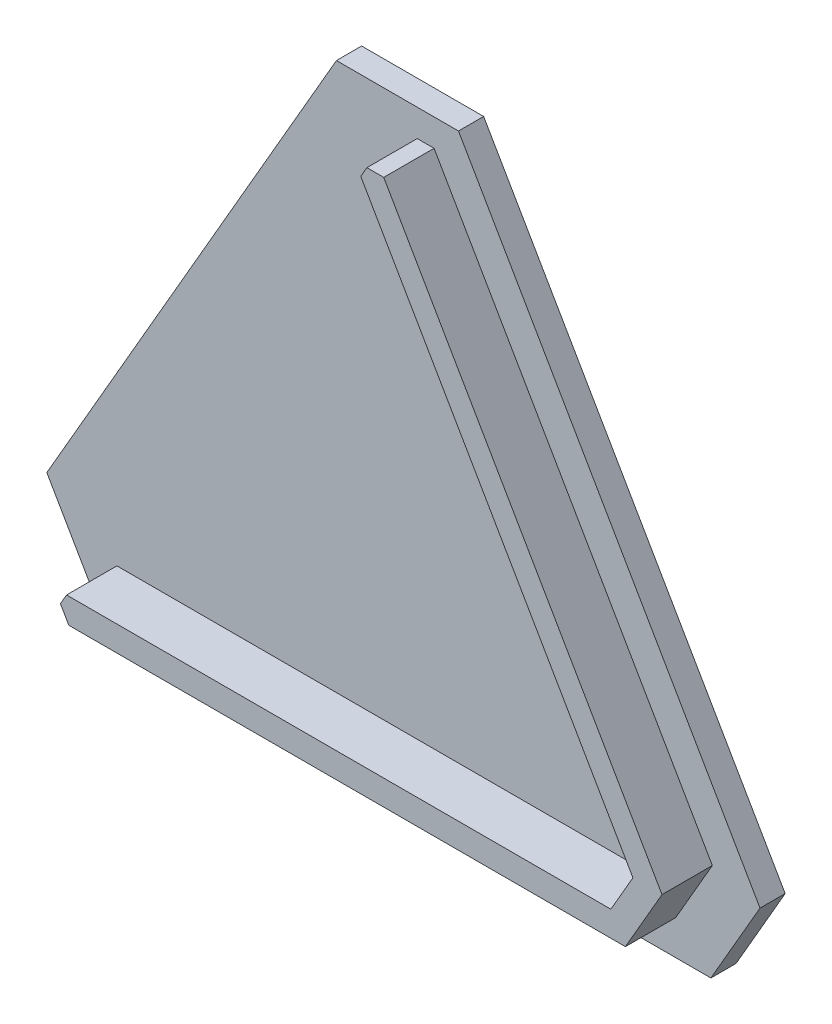
ISO-10303-21;
HEADER;
FILE_DESCRIPTION(('STEP AP214'),'2;1');
FILE_NAME('part.step','',(''),(''),'','','');
FILE_SCHEMA(('AUTOMOTIVE_DESIGN { 1 0 10303 214 1 1 1 1 }'));
ENDSEC;
DATA;
#1=APPLICATION_CONTEXT('core data for automotive mechanical design processes');
#2=APPLICATION_PROTOCOL_DEFINITION('international standard','automotive_design',2000,#1);
#3=PRODUCT_CONTEXT('',#1,'mechanical');
#4=PRODUCT('Part','Part','',(#3));
#5=PRODUCT_RELATED_PRODUCT_CATEGORY('part','',(#4));
#6=PRODUCT_DEFINITION_FORMATION('','',#4);
#7=PRODUCT_DEFINITION_CONTEXT('part definition',#1,'design');
#8=PRODUCT_DEFINITION('design','',#6,#7);
#9=PRODUCT_DEFINITION_SHAPE('','',#8);
#10=(LENGTH_UNIT() NAMED_UNIT(*) SI_UNIT(.MILLI.,.METRE.));
#11=(NAMED_UNIT(*) PLANE_ANGLE_UNIT() SI_UNIT($,.RADIAN.));
#12=(NAMED_UNIT(*) SI_UNIT($,.STERADIAN.) SOLID_ANGLE_UNIT());
#13=UNCERTAINTY_MEASURE_WITH_UNIT(LENGTH_MEASURE(1.E-05),#10,'distance_accuracy_value','');
#14=(GEOMETRIC_REPRESENTATION_CONTEXT(3) GLOBAL_UNCERTAINTY_ASSIGNED_CONTEXT((#13)) GLOBAL_UNIT_ASSIGNED_CONTEXT((#10,
#11,#12)) REPRESENTATION_CONTEXT('',''));
#15=CARTESIAN_POINT('',(0.,0.,0.));
#16=DIRECTION('',(0.,0.,1.));
#17=DIRECTION('',(1.,0.,0.));
#18=AXIS2_PLACEMENT_3D('',#15,#16,#17);
#19=CARTESIAN_POINT('',(222.11595741586,-44.1065145182755,287.147776460053));
#20=DIRECTION('',(0.,1.,0.));
#21=DIRECTION('',(0.,0.,-1.));
#22=AXIS2_PLACEMENT_3D('',#19,#20,#21);
#23=PLANE('',#22);
#24=DIRECTION('',(-1.,0.,0.));
#25=VECTOR('',#24,1.);
#26=CARTESIAN_POINT('',(222.11595741586,-44.1065145182755,277.147776460053));
#27=LINE('',#26,#25);
#28=CARTESIAN_POINT('',(222.11595741586,-44.1065145182755,277.147776460053));
#29=VERTEX_POINT('',#28);
#30=CARTESIAN_POINT('',(218.778432853491,-44.1065145182755,277.147776460053));
#31=VERTEX_POINT('',#30);
#32=EDGE_CURVE('E143',#29,#31,#27,.T.);
#33=ORIENTED_EDGE('',*,*,#32,.T.);
#34=DIRECTION('',(0.,0.,-1.));
#35=VECTOR('',#34,1.);
#36=CARTESIAN_POINT('',(218.778432853491,-44.1065145182755,287.147776460053));
#37=LINE('',#36,#35);
#38=CARTESIAN_POINT('',(218.778432853491,-44.1065145182755,287.147776460053));
#39=VERTEX_POINT('',#38);
#40=EDGE_CURVE('E38',#39,#31,#37,.T.);
#41=ORIENTED_EDGE('',*,*,#40,.F.);
#42=DIRECTION('',(-1.,0.,0.));
#43=VECTOR('',#42,1.);
#44=CARTESIAN_POINT('',(222.11595741586,-44.1065145182755,287.147776460053));
#45=LINE('',#44,#43);
#46=CARTESIAN_POINT('',(222.11595741586,-44.1065145182755,287.147776460053));
#47=VERTEX_POINT('',#46);
#48=EDGE_CURVE('E162',#47,#39,#45,.T.);
#49=ORIENTED_EDGE('',*,*,#48,.F.);
#50=DIRECTION('',(0.,0.,-1.));
#51=VECTOR('',#50,1.);
#52=CARTESIAN_POINT('',(222.11595741586,-44.1065145182755,287.147776460053));
#53=LINE('',#52,#51);
#54=EDGE_CURVE('E11',#47,#29,#53,.T.);
#55=ORIENTED_EDGE('',*,*,#54,.T.);
#56=EDGE_LOOP('',(#33,#41,#49,#55));
#57=FACE_BOUND('',#56,.T.);
#58=ADVANCED_FACE('F35',(#57),#23,.T.);
#59=CARTESIAN_POINT('',(222.11595741586,-44.1065145182755,287.147776460053));
#60=DIRECTION('',(0.866025403784439,0.5,0.));
#61=DIRECTION('',(-0.5,0.866025403784439,0.));
#62=AXIS2_PLACEMENT_3D('',#59,#60,#61);
#63=PLANE('',#62);
#64=DIRECTION('',(-0.5,0.866025403784439,0.));
#65=VECTOR('',#64,1.);
#66=CARTESIAN_POINT('',(222.11595741586,-44.1065145182755,277.147776460053));
#67=LINE('',#66,#65);
#68=CARTESIAN_POINT('',(277.385017308185,-139.835334338348,277.147776460053));
#69=VERTEX_POINT('',#68);
#70=EDGE_CURVE('E92',#69,#29,#67,.T.);
#71=ORIENTED_EDGE('',*,*,#70,.T.);
#72=ORIENTED_EDGE('',*,*,#54,.F.);
#73=DIRECTION('',(-0.5,0.866025403784439,0.));
#74=VECTOR('',#73,1.);
#75=CARTESIAN_POINT('',(222.11595741586,-44.1065145182755,287.147776460053));
#76=LINE('',#75,#74);
#77=CARTESIAN_POINT('',(277.385017308185,-139.835334338348,287.147776460053));
#78=VERTEX_POINT('',#77);
#79=EDGE_CURVE('E53',#78,#47,#76,.T.);
#80=ORIENTED_EDGE('',*,*,#79,.F.);
#81=DIRECTION('',(0.,0.,-1.));
#82=VECTOR('',#81,1.);
#83=CARTESIAN_POINT('',(277.385017308185,-139.835334338348,287.147776460053));
#84=LINE('',#83,#82);
#85=EDGE_CURVE('E44',#78,#69,#84,.T.);
#86=ORIENTED_EDGE('',*,*,#85,.T.);
#87=EDGE_LOOP('',(#71,#72,#80,#86));
#88=FACE_BOUND('',#87,.T.);
#89=ADVANCED_FACE('F229',(#88),#63,.T.);
#90=CARTESIAN_POINT('',(277.385017308185,-139.835334338348,287.147776460053));
#91=DIRECTION('',(0.866025403784438,-0.500000000000001,0.));
#92=DIRECTION('',(0.500000000000001,0.866025403784438,0.));
#93=AXIS2_PLACEMENT_3D('',#90,#91,#92);
#94=PLANE('',#93);
#95=DIRECTION('',(0.500000000000001,0.866025403784438,0.));
#96=VECTOR('',#95,1.);
#97=CARTESIAN_POINT('',(277.385017308185,-139.835334338348,277.147776460053));
#98=LINE('',#97,#96);
#99=CARTESIAN_POINT('',(270.11595741586,-152.425715395115,277.147776460053));
#100=VERTEX_POINT('',#99);
#101=EDGE_CURVE('E86',#100,#69,#98,.T.);
#102=ORIENTED_EDGE('',*,*,#101,.T.);
#103=ORIENTED_EDGE('',*,*,#85,.F.);
#104=DIRECTION('',(0.500000000000001,0.866025403784438,0.));
#105=VECTOR('',#104,1.);
#106=CARTESIAN_POINT('',(277.385017308185,-139.835334338348,287.147776460053));
#107=LINE('',#106,#105);
#108=CARTESIAN_POINT('',(270.11595741586,-152.425715395115,287.147776460053));
#109=VERTEX_POINT('',#108);
#110=EDGE_CURVE('E125',#109,#78,#107,.T.);
#111=ORIENTED_EDGE('',*,*,#110,.F.);
#112=DIRECTION('',(0.,0.,-1.));
#113=VECTOR('',#112,1.);
#114=CARTESIAN_POINT('',(270.11595741586,-152.425715395115,287.147776460053));
#115=LINE('',#114,#113);
#116=EDGE_CURVE('E132',#109,#100,#115,.T.);
#117=ORIENTED_EDGE('',*,*,#116,.T.);
#118=EDGE_LOOP('',(#102,#103,#111,#117));
#119=FACE_BOUND('',#118,.T.);
#120=ADVANCED_FACE('F138',(#119),#94,.T.);
#121=CARTESIAN_POINT('',(270.11595741586,-152.425715395115,287.147776460053));
#122=DIRECTION('',(0.,-1.,0.));
#123=DIRECTION('',(1.,0.,0.));
#124=AXIS2_PLACEMENT_3D('',#121,#122,#123);
#125=PLANE('',#124);
#126=DIRECTION('',(1.,0.,0.));
#127=VECTOR('',#126,1.);
#128=CARTESIAN_POINT('',(270.11595741586,-152.425715395115,277.147776460053));
#129=LINE('',#128,#127);
#130=CARTESIAN_POINT('',(159.577837631212,-152.425715395115,277.147776460053));
#131=VERTEX_POINT('',#130);
#132=EDGE_CURVE('E135',#131,#100,#129,.T.);
#133=ORIENTED_EDGE('',*,*,#132,.T.);
#134=ORIENTED_EDGE('',*,*,#116,.F.);
#135=DIRECTION('',(1.,0.,0.));
#136=VECTOR('',#135,1.);
#137=CARTESIAN_POINT('',(270.11595741586,-152.425715395115,287.147776460053));
#138=LINE('',#137,#136);
#139=CARTESIAN_POINT('',(159.577837631212,-152.425715395115,287.147776460053));
#140=VERTEX_POINT('',#139);
#141=EDGE_CURVE('E121',#140,#109,#138,.T.);
#142=ORIENTED_EDGE('',*,*,#141,.F.);
#143=DIRECTION('',(0.,0.,-1.));
#144=VECTOR('',#143,1.);
#145=CARTESIAN_POINT('',(159.577837631212,-152.425715395115,287.147776460053));
#146=LINE('',#145,#144);
#147=EDGE_CURVE('E136',#140,#131,#146,.T.);
#148=ORIENTED_EDGE('',*,*,#147,.T.);
#149=EDGE_LOOP('',(#133,#134,#142,#148));
#150=FACE_BOUND('',#149,.T.);
#151=ADVANCED_FACE('F133',(#150),#125,.T.);
#152=CARTESIAN_POINT('',(159.577837631212,-152.425715395115,287.147776460053));
#153=DIRECTION('',(-0.866025403784441,-0.499999999999996,0.));
#154=DIRECTION('',(0.499999999999996,-0.866025403784441,0.));
#155=AXIS2_PLACEMENT_3D('',#152,#153,#154);
#156=PLANE('',#155);
#157=DIRECTION('',(0.499999999999996,-0.866025403784441,0.));
#158=VECTOR('',#157,1.);
#159=CARTESIAN_POINT('',(159.577837631212,-152.425715395115,277.147776460053));
#160=LINE('',#159,#158);
#161=CARTESIAN_POINT('',(157.909075350027,-149.535334338348,277.147776460053));
#162=VERTEX_POINT('',#161);
#163=EDGE_CURVE('E158',#162,#131,#160,.T.);
#164=ORIENTED_EDGE('',*,*,#163,.T.);
#165=ORIENTED_EDGE('',*,*,#147,.F.);
#166=DIRECTION('',(0.499999999999996,-0.866025403784441,0.));
#167=VECTOR('',#166,1.);
#168=CARTESIAN_POINT('',(159.577837631212,-152.425715395115,287.147776460053));
#169=LINE('',#168,#167);
#170=CARTESIAN_POINT('',(157.909075350027,-149.535334338348,287.147776460053));
#171=VERTEX_POINT('',#170);
#172=EDGE_CURVE('E127',#171,#140,#169,.T.);
#173=ORIENTED_EDGE('',*,*,#172,.F.);
#174=DIRECTION('',(0.,0.,-1.));
#175=VECTOR('',#174,1.);
#176=CARTESIAN_POINT('',(157.909075350027,-149.535334338348,287.147776460053));
#177=LINE('',#176,#175);
#178=EDGE_CURVE('E166',#171,#162,#177,.T.);
#179=ORIENTED_EDGE('',*,*,#178,.T.);
#180=EDGE_LOOP('',(#164,#165,#173,#179));
#181=FACE_BOUND('',#180,.T.);
#182=ADVANCED_FACE('F217',(#181),#156,.T.);
#183=CARTESIAN_POINT('',(157.909075350027,-149.535334338348,287.147776460053));
#184=DIRECTION('',(-0.866025403784442,0.499999999999994,0.));
#185=DIRECTION('',(-0.499999999999994,-0.866025403784442,0.));
#186=AXIS2_PLACEMENT_3D('',#183,#184,#185);
#187=PLANE('',#186);
#188=DIRECTION('',(-0.499999999999994,-0.866025403784442,0.));
#189=VECTOR('',#188,1.);
#190=CARTESIAN_POINT('',(157.909075350027,-149.535334338348,277.147776460053));
#191=LINE('',#190,#189);
#192=CARTESIAN_POINT('',(159.127064414791,-147.425715395115,277.147776460053));
#193=VERTEX_POINT('',#192);
#194=EDGE_CURVE('E156',#193,#162,#191,.T.);
#195=ORIENTED_EDGE('',*,*,#194,.T.);
#196=ORIENTED_EDGE('',*,*,#178,.F.);
#197=DIRECTION('',(-0.499999999999994,-0.866025403784442,0.));
#198=VECTOR('',#197,1.);
#199=CARTESIAN_POINT('',(157.909075350027,-149.535334338348,287.147776460053));
#200=LINE('',#199,#198);
#201=CARTESIAN_POINT('',(159.127064414791,-147.425715395115,287.147776460053));
#202=VERTEX_POINT('',#201);
#203=EDGE_CURVE('E204',#202,#171,#200,.T.);
#204=ORIENTED_EDGE('',*,*,#203,.F.);
#205=DIRECTION('',(0.,0.,-1.));
#206=VECTOR('',#205,1.);
#207=CARTESIAN_POINT('',(159.127064414791,-147.425715395115,287.147776460053));
#208=LINE('',#207,#206);
#209=EDGE_CURVE('E169',#202,#193,#208,.T.);
#210=ORIENTED_EDGE('',*,*,#209,.T.);
#211=EDGE_LOOP('',(#195,#196,#204,#210));
#212=FACE_BOUND('',#211,.T.);
#213=ADVANCED_FACE('F213',(#212),#187,.T.);
#214=CARTESIAN_POINT('',(159.127064414791,-147.425715395115,287.147776460053));
#215=DIRECTION('',(0.,1.,0.));
#216=DIRECTION('',(0.,0.,-1.));
#217=AXIS2_PLACEMENT_3D('',#214,#215,#216);
#218=PLANE('',#217);
#219=DIRECTION('',(-1.,0.,0.));
#220=VECTOR('',#219,1.);
#221=CARTESIAN_POINT('',(159.127064414791,-147.425715395115,277.147776460053));
#222=LINE('',#221,#220);
#223=CARTESIAN_POINT('',(267.229206069912,-147.425715395115,277.147776460053));
#224=VERTEX_POINT('',#223);
#225=EDGE_CURVE('E154',#224,#193,#222,.T.);
#226=ORIENTED_EDGE('',*,*,#225,.T.);
#227=ORIENTED_EDGE('',*,*,#209,.F.);
#228=DIRECTION('',(-1.,0.,0.));
#229=VECTOR('',#228,1.);
#230=CARTESIAN_POINT('',(159.127064414791,-147.425715395115,287.147776460053));
#231=LINE('',#230,#229);
#232=CARTESIAN_POINT('',(267.229206069912,-147.425715395115,287.147776460053));
#233=VERTEX_POINT('',#232);
#234=EDGE_CURVE('E201',#233,#202,#231,.T.);
#235=ORIENTED_EDGE('',*,*,#234,.F.);
#236=DIRECTION('',(0.,0.,-1.));
#237=VECTOR('',#236,1.);
#238=CARTESIAN_POINT('',(267.229206069912,-147.425715395115,287.147776460053));
#239=LINE('',#238,#237);
#240=EDGE_CURVE('E172',#233,#224,#239,.T.);
#241=ORIENTED_EDGE('',*,*,#240,.T.);
#242=EDGE_LOOP('',(#226,#227,#235,#241));
#243=FACE_BOUND('',#242,.T.);
#244=ADVANCED_FACE('F219',(#243),#218,.T.);
#245=CARTESIAN_POINT('',(267.229206069912,-147.425715395115,287.147776460053));
#246=DIRECTION('',(-0.866025403784438,0.500000000000001,0.));
#247=DIRECTION('',(-0.500000000000001,-0.866025403784438,0.));
#248=AXIS2_PLACEMENT_3D('',#245,#246,#247);
#249=PLANE('',#248);
#250=DIRECTION('',(-0.500000000000001,-0.866025403784438,0.));
#251=VECTOR('',#250,1.);
#252=CARTESIAN_POINT('',(267.229206069912,-147.425715395115,277.147776460053));
#253=LINE('',#252,#251);
#254=CARTESIAN_POINT('',(271.611514616288,-139.835334338348,277.147776460053));
#255=VERTEX_POINT('',#254);
#256=EDGE_CURVE('E152',#255,#224,#253,.T.);
#257=ORIENTED_EDGE('',*,*,#256,.T.);
#258=ORIENTED_EDGE('',*,*,#240,.F.);
#259=DIRECTION('',(-0.500000000000001,-0.866025403784438,0.));
#260=VECTOR('',#259,1.);
#261=CARTESIAN_POINT('',(267.229206069912,-147.425715395115,287.147776460053));
#262=LINE('',#261,#260);
#263=CARTESIAN_POINT('',(271.611514616288,-139.835334338348,287.147776460053));
#264=VERTEX_POINT('',#263);
#265=EDGE_CURVE('E199',#264,#233,#262,.T.);
#266=ORIENTED_EDGE('',*,*,#265,.F.);
#267=DIRECTION('',(0.,0.,-1.));
#268=VECTOR('',#267,1.);
#269=CARTESIAN_POINT('',(271.611514616288,-139.835334338348,287.147776460053));
#270=LINE('',#269,#268);
#271=EDGE_CURVE('E175',#264,#255,#270,.T.);
#272=ORIENTED_EDGE('',*,*,#271,.T.);
#273=EDGE_LOOP('',(#257,#258,#266,#272));
#274=FACE_BOUND('',#273,.T.);
#275=ADVANCED_FACE('F197',(#274),#249,.T.);
#276=CARTESIAN_POINT('',(271.611514616288,-139.835334338348,287.147776460053));
#277=DIRECTION('',(-0.866025403784438,-0.5,0.));
#278=DIRECTION('',(0.5,-0.866025403784439,0.));
#279=AXIS2_PLACEMENT_3D('',#276,#277,#278);
#280=PLANE('',#279);
#281=DIRECTION('',(0.5,-0.866025403784438,0.));
#282=VECTOR('',#281,1.);
#283=CARTESIAN_POINT('',(271.611514616288,-139.835334338348,277.147776460053));
#284=LINE('',#283,#282);
#285=CARTESIAN_POINT('',(217.560443788727,-46.2161334615091,277.147776460053));
#286=VERTEX_POINT('',#285);
#287=EDGE_CURVE('E150',#286,#255,#284,.T.);
#288=ORIENTED_EDGE('',*,*,#287,.T.);
#289=ORIENTED_EDGE('',*,*,#271,.F.);
#290=DIRECTION('',(0.5,-0.866025403784438,0.));
#291=VECTOR('',#290,1.);
#292=CARTESIAN_POINT('',(271.611514616288,-139.835334338348,287.147776460053));
#293=LINE('',#292,#291);
#294=CARTESIAN_POINT('',(217.560443788727,-46.2161334615091,287.147776460053));
#295=VERTEX_POINT('',#294);
#296=EDGE_CURVE('E202',#295,#264,#293,.T.);
#297=ORIENTED_EDGE('',*,*,#296,.F.);
#298=DIRECTION('',(0.,0.,-1.));
#299=VECTOR('',#298,1.);
#300=CARTESIAN_POINT('',(217.560443788727,-46.2161334615091,287.147776460053));
#301=LINE('',#300,#299);
#302=EDGE_CURVE('E177',#295,#286,#301,.T.);
#303=ORIENTED_EDGE('',*,*,#302,.T.);
#304=EDGE_LOOP('',(#288,#289,#297,#303));
#305=FACE_BOUND('',#304,.T.);
#306=ADVANCED_FACE('F194',(#305),#280,.T.);
#307=CARTESIAN_POINT('',(218.778432853491,-44.1065145182755,287.147776460053));
#308=DIRECTION('',(-0.866025403784437,0.500000000000003,0.));
#309=DIRECTION('',(-0.500000000000003,-0.866025403784437,0.));
#310=AXIS2_PLACEMENT_3D('',#307,#308,#309);
#311=PLANE('',#310);
#312=DIRECTION('',(-0.500000000000003,-0.866025403784437,0.));
#313=VECTOR('',#312,1.);
#314=CARTESIAN_POINT('',(218.778432853491,-44.1065145182755,277.147776460053));
#315=LINE('',#314,#313);
#316=EDGE_CURVE('E146',#31,#286,#315,.T.);
#317=ORIENTED_EDGE('',*,*,#316,.T.);
#318=ORIENTED_EDGE('',*,*,#302,.F.);
#319=DIRECTION('',(-0.500000000000003,-0.866025403784437,0.));
#320=VECTOR('',#319,1.);
#321=CARTESIAN_POINT('',(218.778432853491,-44.1065145182755,287.147776460053));
#322=LINE('',#321,#320);
#323=EDGE_CURVE('E100',#39,#295,#322,.T.);
#324=ORIENTED_EDGE('',*,*,#323,.F.);
#325=ORIENTED_EDGE('',*,*,#40,.T.);
#326=EDGE_LOOP('',(#317,#318,#324,#325));
#327=FACE_BOUND('',#326,.T.);
#328=ADVANCED_FACE('F183',(#327),#311,.T.);
#329=CARTESIAN_POINT('',(218.778432853491,-44.1065145182755,287.147776460053));
#330=DIRECTION('',(0.,0.,-1.));
#331=DIRECTION('',(1.,0.,0.));
#332=AXIS2_PLACEMENT_3D('',#329,#330,#331);
#333=PLANE('',#332);
#334=ORIENTED_EDGE('',*,*,#48,.T.);
#335=ORIENTED_EDGE('',*,*,#323,.T.);
#336=ORIENTED_EDGE('',*,*,#296,.T.);
#337=ORIENTED_EDGE('',*,*,#265,.T.);
#338=ORIENTED_EDGE('',*,*,#234,.T.);
#339=ORIENTED_EDGE('',*,*,#203,.T.);
#340=ORIENTED_EDGE('',*,*,#172,.T.);
#341=ORIENTED_EDGE('',*,*,#141,.T.);
#342=ORIENTED_EDGE('',*,*,#110,.T.);
#343=ORIENTED_EDGE('',*,*,#79,.T.);
#344=EDGE_LOOP('',(#334,#335,#336,#337,#338,#339,#340,#341,#342,#343));
#345=FACE_BOUND('',#344,.T.);
#346=ADVANCED_FACE('F123',(#345),#333,.F.);
#347=CARTESIAN_POINT('',(145.207369427855,-138.335334338348,272.147776460053));
#348=DIRECTION('',(0.866025403784439,-0.499999999999999,0.));
#349=DIRECTION('',(0.499999999999999,0.866025403784439,0.));
#350=AXIS2_PLACEMENT_3D('',#347,#348,#349);
#351=PLANE('',#350);
#352=DIRECTION('',(-0.499999999999999,-0.866025403784439,0.));
#353=VECTOR('',#352,1.);
#354=CARTESIAN_POINT('',(145.207369427855,-138.335334338348,277.147776460053));
#355=LINE('',#354,#353);
#356=CARTESIAN_POINT('',(202.728095370019,-38.7065145182755,277.147776460053));
#357=VERTEX_POINT('',#356);
#358=CARTESIAN_POINT('',(145.207369427855,-138.335334338348,277.147776460053));
#359=VERTEX_POINT('',#358);
#360=EDGE_CURVE('E448',#357,#359,#355,.T.);
#361=ORIENTED_EDGE('',*,*,#360,.F.);
#362=DIRECTION('',(0.,0.,1.));
#363=VECTOR('',#362,1.);
#364=CARTESIAN_POINT('',(202.728095370019,-38.7065145182755,272.147776460053));
#365=LINE('',#364,#363);
#366=CARTESIAN_POINT('',(202.728095370019,-38.7065145182755,272.147776460053));
#367=VERTEX_POINT('',#366);
#368=EDGE_CURVE('E445',#367,#357,#365,.T.);
#369=ORIENTED_EDGE('',*,*,#368,.F.);
#370=DIRECTION('',(-0.499999999999999,-0.866025403784439,0.));
#371=VECTOR('',#370,1.);
#372=CARTESIAN_POINT('',(145.207369427855,-138.335334338348,272.147776460053));
#373=LINE('',#372,#371);
#374=CARTESIAN_POINT('',(145.207369427855,-138.335334338348,272.147776460053));
#375=VERTEX_POINT('',#374);
#376=EDGE_CURVE('E427',#367,#375,#373,.T.);
#377=ORIENTED_EDGE('',*,*,#376,.T.);
#378=DIRECTION('',(0.,0.,1.));
#379=VECTOR('',#378,1.);
#380=CARTESIAN_POINT('',(145.207369427855,-138.335334338348,272.147776460053));
#381=LINE('',#380,#379);
#382=EDGE_CURVE('E147',#375,#359,#381,.T.);
#383=ORIENTED_EDGE('',*,*,#382,.T.);
#384=EDGE_LOOP('',(#361,#369,#377,#383));
#385=FACE_BOUND('',#384,.T.);
#386=ADVANCED_FACE('F286',(#385),#351,.F.);
#387=CARTESIAN_POINT('',(157.326171581372,-159.325715395115,272.147776460053));
#388=DIRECTION('',(0.866025403784439,0.5,0.));
#389=DIRECTION('',(-0.5,0.866025403784439,0.));
#390=AXIS2_PLACEMENT_3D('',#387,#388,#389);
#391=PLANE('',#390);
#392=DIRECTION('',(0.5,-0.866025403784439,0.));
#393=VECTOR('',#392,1.);
#394=CARTESIAN_POINT('',(157.326171581372,-159.325715395115,277.147776460053));
#395=LINE('',#394,#393);
#396=CARTESIAN_POINT('',(157.326171581372,-159.325715395115,277.147776460053));
#397=VERTEX_POINT('',#396);
#398=EDGE_CURVE('E476',#359,#397,#395,.T.);
#399=ORIENTED_EDGE('',*,*,#398,.F.);
#400=ORIENTED_EDGE('',*,*,#382,.F.);
#401=DIRECTION('',(0.5,-0.866025403784439,0.));
#402=VECTOR('',#401,1.);
#403=CARTESIAN_POINT('',(157.326171581372,-159.325715395115,272.147776460053));
#404=LINE('',#403,#402);
#405=CARTESIAN_POINT('',(157.326171581372,-159.325715395115,272.147776460053));
#406=VERTEX_POINT('',#405);
#407=EDGE_CURVE('E437',#375,#406,#404,.T.);
#408=ORIENTED_EDGE('',*,*,#407,.T.);
#409=DIRECTION('',(0.,0.,1.));
#410=VECTOR('',#409,1.);
#411=CARTESIAN_POINT('',(157.326171581372,-159.325715395115,272.147776460053));
#412=LINE('',#411,#410);
#413=EDGE_CURVE('E465',#406,#397,#412,.T.);
#414=ORIENTED_EDGE('',*,*,#413,.T.);
#415=EDGE_LOOP('',(#399,#400,#408,#414));
#416=FACE_BOUND('',#415,.T.);
#417=ADVANCED_FACE('F294',(#416),#391,.F.);
#418=CARTESIAN_POINT('',(277.096897523536,-159.325715395115,272.147776460053));
#419=DIRECTION('',(0.,1.,0.));
#420=DIRECTION('',(0.,0.,-1.));
#421=AXIS2_PLACEMENT_3D('',#418,#419,#420);
#422=PLANE('',#421);
#423=DIRECTION('',(1.,0.,0.));
#424=VECTOR('',#423,1.);
#425=CARTESIAN_POINT('',(277.096897523536,-159.325715395115,277.147776460053));
#426=LINE('',#425,#424);
#427=CARTESIAN_POINT('',(277.096897523536,-159.325715395115,277.147776460053));
#428=VERTEX_POINT('',#427);
#429=EDGE_CURVE('E479',#397,#428,#426,.T.);
#430=ORIENTED_EDGE('',*,*,#429,.F.);
#431=ORIENTED_EDGE('',*,*,#413,.F.);
#432=DIRECTION('',(1.,0.,0.));
#433=VECTOR('',#432,1.);
#434=CARTESIAN_POINT('',(277.096897523536,-159.325715395115,272.147776460053));
#435=LINE('',#434,#433);
#436=CARTESIAN_POINT('',(277.096897523536,-159.325715395115,272.147776460053));
#437=VERTEX_POINT('',#436);
#438=EDGE_CURVE('E504',#406,#437,#435,.T.);
#439=ORIENTED_EDGE('',*,*,#438,.T.);
#440=DIRECTION('',(0.,0.,1.));
#441=VECTOR('',#440,1.);
#442=CARTESIAN_POINT('',(277.096897523536,-159.325715395115,272.147776460053));
#443=LINE('',#442,#441);
#444=EDGE_CURVE('E462',#437,#428,#443,.T.);
#445=ORIENTED_EDGE('',*,*,#444,.T.);
#446=EDGE_LOOP('',(#430,#431,#439,#445));
#447=FACE_BOUND('',#446,.T.);
#448=ADVANCED_FACE('F303',(#447),#422,.F.);
#449=CARTESIAN_POINT('',(286.851062648135,-142.431005813893,272.147776460053));
#450=DIRECTION('',(-0.866025403784439,0.5,0.));
#451=DIRECTION('',(-0.5,-0.866025403784439,0.));
#452=AXIS2_PLACEMENT_3D('',#449,#450,#451);
#453=PLANE('',#452);
#454=DIRECTION('',(0.5,0.866025403784439,0.));
#455=VECTOR('',#454,1.);
#456=CARTESIAN_POINT('',(286.851062648135,-142.431005813893,277.147776460053));
#457=LINE('',#456,#455);
#458=CARTESIAN_POINT('',(286.851062648135,-142.431005813893,277.147776460053));
#459=VERTEX_POINT('',#458);
#460=EDGE_CURVE('E484',#428,#459,#457,.T.);
#461=ORIENTED_EDGE('',*,*,#460,.F.);
#462=ORIENTED_EDGE('',*,*,#444,.F.);
#463=DIRECTION('',(0.5,0.866025403784439,0.));
#464=VECTOR('',#463,1.);
#465=CARTESIAN_POINT('',(286.851062648135,-142.431005813893,272.147776460053));
#466=LINE('',#465,#464);
#467=CARTESIAN_POINT('',(286.851062648135,-142.431005813893,272.147776460053));
#468=VERTEX_POINT('',#467);
#469=EDGE_CURVE('E500',#437,#468,#466,.T.);
#470=ORIENTED_EDGE('',*,*,#469,.T.);
#471=DIRECTION('',(0.,0.,1.));
#472=VECTOR('',#471,1.);
#473=CARTESIAN_POINT('',(286.851062648135,-142.431005813893,272.147776460053));
#474=LINE('',#473,#472);
#475=EDGE_CURVE('E453',#468,#459,#474,.T.);
#476=ORIENTED_EDGE('',*,*,#475,.T.);
#477=EDGE_LOOP('',(#461,#462,#470,#476));
#478=FACE_BOUND('',#477,.T.);
#479=ADVANCED_FACE('F313',(#478),#453,.F.);
#480=CARTESIAN_POINT('',(226.965699677053,-38.7065145182755,272.147776460053));
#481=DIRECTION('',(-0.866025403784438,-0.5,0.));
#482=DIRECTION('',(0.5,-0.866025403784438,0.));
#483=AXIS2_PLACEMENT_3D('',#480,#481,#482);
#484=PLANE('',#483);
#485=DIRECTION('',(-0.5,0.866025403784438,0.));
#486=VECTOR('',#485,1.);
#487=CARTESIAN_POINT('',(226.965699677053,-38.7065145182755,277.147776460053));
#488=LINE('',#487,#486);
#489=CARTESIAN_POINT('',(226.965699677053,-38.7065145182755,277.147776460053));
#490=VERTEX_POINT('',#489);
#491=EDGE_CURVE('E486',#459,#490,#488,.T.);
#492=ORIENTED_EDGE('',*,*,#491,.F.);
#493=ORIENTED_EDGE('',*,*,#475,.F.);
#494=DIRECTION('',(-0.5,0.866025403784438,0.));
#495=VECTOR('',#494,1.);
#496=CARTESIAN_POINT('',(226.965699677053,-38.7065145182755,272.147776460053));
#497=LINE('',#496,#495);
#498=CARTESIAN_POINT('',(226.965699677053,-38.7065145182755,272.147776460053));
#499=VERTEX_POINT('',#498);
#500=EDGE_CURVE('E455',#468,#499,#497,.T.);
#501=ORIENTED_EDGE('',*,*,#500,.T.);
#502=DIRECTION('',(0.,0.,1.));
#503=VECTOR('',#502,1.);
#504=CARTESIAN_POINT('',(226.965699677053,-38.7065145182755,272.147776460053));
#505=LINE('',#504,#503);
#506=EDGE_CURVE('E450',#499,#490,#505,.T.);
#507=ORIENTED_EDGE('',*,*,#506,.T.);
#508=EDGE_LOOP('',(#492,#493,#501,#507));
#509=FACE_BOUND('',#508,.T.);
#510=ADVANCED_FACE('F323',(#509),#484,.F.);
#511=CARTESIAN_POINT('',(202.728095370019,-38.7065145182755,272.147776460053));
#512=DIRECTION('',(0.,-1.,0.));
#513=DIRECTION('',(0.,0.,1.));
#514=AXIS2_PLACEMENT_3D('',#511,#512,#513);
#515=PLANE('',#514);
#516=DIRECTION('',(-1.,0.,0.));
#517=VECTOR('',#516,1.);
#518=CARTESIAN_POINT('',(202.728095370019,-38.7065145182755,277.147776460053));
#519=LINE('',#518,#517);
#520=EDGE_CURVE('E441',#490,#357,#519,.T.);
#521=ORIENTED_EDGE('',*,*,#520,.F.);
#522=ORIENTED_EDGE('',*,*,#506,.F.);
#523=DIRECTION('',(-1.,0.,0.));
#524=VECTOR('',#523,1.);
#525=CARTESIAN_POINT('',(202.728095370019,-38.7065145182755,272.147776460053));
#526=LINE('',#525,#524);
#527=EDGE_CURVE('E432',#499,#367,#526,.T.);
#528=ORIENTED_EDGE('',*,*,#527,.T.);
#529=ORIENTED_EDGE('',*,*,#368,.T.);
#530=EDGE_LOOP('',(#521,#522,#528,#529));
#531=FACE_BOUND('',#530,.T.);
#532=ADVANCED_FACE('F333',(#531),#515,.F.);
#533=CARTESIAN_POINT('',(202.728095370019,-38.7065145182755,272.147776460053));
#534=DIRECTION('',(0.,0.,1.));
#535=DIRECTION('',(-1.,0.,0.));
#536=AXIS2_PLACEMENT_3D('',#533,#534,#535);
#537=PLANE('',#536);
#538=ORIENTED_EDGE('',*,*,#376,.F.);
#539=ORIENTED_EDGE('',*,*,#527,.F.);
#540=ORIENTED_EDGE('',*,*,#500,.F.);
#541=ORIENTED_EDGE('',*,*,#469,.F.);
#542=ORIENTED_EDGE('',*,*,#438,.F.);
#543=ORIENTED_EDGE('',*,*,#407,.F.);
#544=EDGE_LOOP('',(#538,#539,#540,#541,#542,#543));
#545=FACE_BOUND('',#544,.T.);
#546=ADVANCED_FACE('F343',(#545),#537,.F.);
#547=CARTESIAN_POINT('',(202.728095370019,-38.7065145182755,277.147776460053));
#548=DIRECTION('',(0.,0.,1.));
#549=DIRECTION('',(-1.,0.,0.));
#550=AXIS2_PLACEMENT_3D('',#547,#548,#549);
#551=PLANE('',#550);
#552=ORIENTED_EDGE('',*,*,#70,.F.);
#553=ORIENTED_EDGE('',*,*,#101,.F.);
#554=ORIENTED_EDGE('',*,*,#132,.F.);
#555=ORIENTED_EDGE('',*,*,#163,.F.);
#556=ORIENTED_EDGE('',*,*,#194,.F.);
#557=ORIENTED_EDGE('',*,*,#225,.F.);
#558=ORIENTED_EDGE('',*,*,#256,.F.);
#559=ORIENTED_EDGE('',*,*,#287,.F.);
#560=ORIENTED_EDGE('',*,*,#316,.F.);
#561=ORIENTED_EDGE('',*,*,#32,.F.);
#562=EDGE_LOOP('',(#552,#553,#554,#555,#556,#557,#558,#559,#560,#561));
#563=FACE_BOUND('',#562,.T.);
#564=ORIENTED_EDGE('',*,*,#360,.T.);
#565=ORIENTED_EDGE('',*,*,#398,.T.);
#566=ORIENTED_EDGE('',*,*,#429,.T.);
#567=ORIENTED_EDGE('',*,*,#460,.T.);
#568=ORIENTED_EDGE('',*,*,#491,.T.);
#569=ORIENTED_EDGE('',*,*,#520,.T.);
#570=EDGE_LOOP('',(#564,#565,#566,#567,#568,#569));
#571=FACE_BOUND('',#570,.T.);
#572=ADVANCED_FACE('F188',(#563,#571),#551,.T.);
#573=CLOSED_SHELL('',(#58,#89,#120,#151,#182,#213,#244,#275,#306,#328,#346,#386,#417,#448,#479,
#510,#532,#546,#572));
#574=MANIFOLD_SOLID_BREP('B2',#573);
#575=ADVANCED_BREP_SHAPE_REPRESENTATION('',(#18,#574),#14);
#576=SHAPE_DEFINITION_REPRESENTATION(#9,#575);
ENDSEC;
END-ISO-10303-21;
